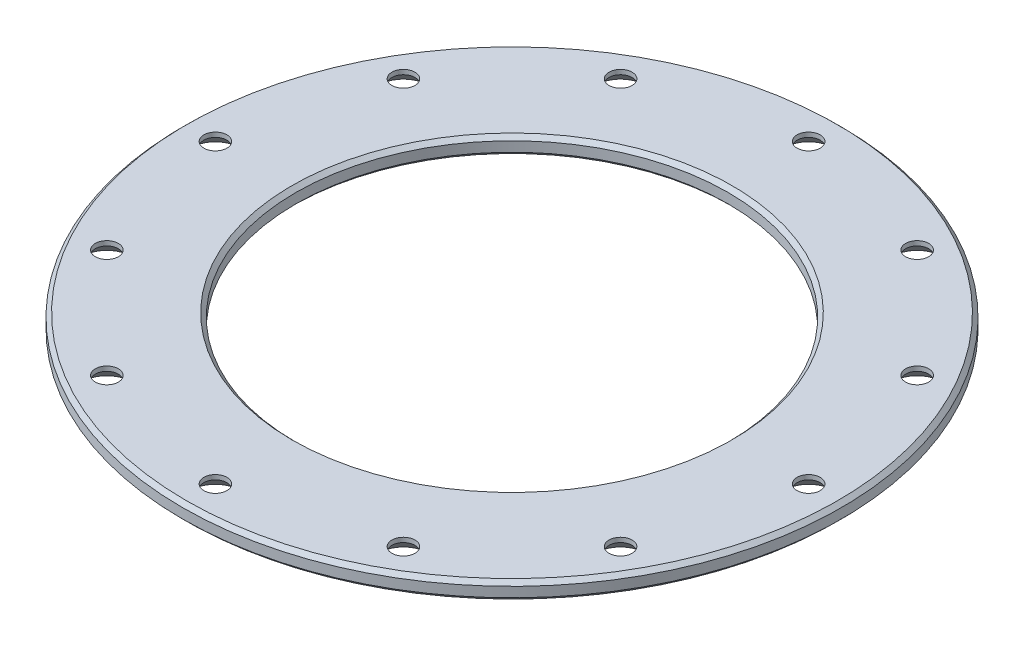
ISO-10303-21;
HEADER;
FILE_DESCRIPTION(('STEP AP214'),'2;1');
FILE_NAME('part.step','',(''),(''),'','','');
FILE_SCHEMA(('AUTOMOTIVE_DESIGN { 1 0 10303 214 1 1 1 1 }'));
ENDSEC;
DATA;
#1=APPLICATION_CONTEXT('core data for automotive mechanical design processes');
#2=APPLICATION_PROTOCOL_DEFINITION('international standard','automotive_design',2000,#1);
#3=PRODUCT_CONTEXT('',#1,'mechanical');
#4=PRODUCT('Part','Part','',(#3));
#5=PRODUCT_RELATED_PRODUCT_CATEGORY('part','',(#4));
#6=PRODUCT_DEFINITION_FORMATION('','',#4);
#7=PRODUCT_DEFINITION_CONTEXT('part definition',#1,'design');
#8=PRODUCT_DEFINITION('design','',#6,#7);
#9=PRODUCT_DEFINITION_SHAPE('','',#8);
#10=(LENGTH_UNIT() NAMED_UNIT(*) SI_UNIT(.MILLI.,.METRE.));
#11=(NAMED_UNIT(*) PLANE_ANGLE_UNIT() SI_UNIT($,.RADIAN.));
#12=(NAMED_UNIT(*) SI_UNIT($,.STERADIAN.) SOLID_ANGLE_UNIT());
#13=UNCERTAINTY_MEASURE_WITH_UNIT(LENGTH_MEASURE(1.E-05),#10,'distance_accuracy_value','');
#14=(GEOMETRIC_REPRESENTATION_CONTEXT(3) GLOBAL_UNCERTAINTY_ASSIGNED_CONTEXT((#13)) GLOBAL_UNIT_ASSIGNED_CONTEXT((#10,
#11,#12)) REPRESENTATION_CONTEXT('',''));
#15=CARTESIAN_POINT('',(0.,0.,0.));
#16=DIRECTION('',(0.,0.,1.));
#17=DIRECTION('',(1.,0.,0.));
#18=AXIS2_PLACEMENT_3D('',#15,#16,#17);
#19=CARTESIAN_POINT('',(0.,0.,0.));
#20=DIRECTION('',(0.,1.,0.));
#21=DIRECTION('',(0.,0.,1.));
#22=AXIS2_PLACEMENT_3D('',#19,#20,#21);
#23=CYLINDRICAL_SURFACE('',#22,50.);
#24=CARTESIAN_POINT('',(0.,-42.4,0.));
#25=DIRECTION('',(0.,-1.,0.));
#26=DIRECTION('',(0.,0.,-1.));
#27=AXIS2_PLACEMENT_3D('',#24,#25,#26);
#28=CIRCLE('',#27,50.);
#29=CARTESIAN_POINT('',(0.,-42.4,-50.));
#30=VERTEX_POINT('',#29);
#31=EDGE_CURVE('E52',#30,#30,#28,.F.);
#32=ORIENTED_EDGE('',*,*,#31,.T.);
#33=EDGE_LOOP('',(#32));
#34=FACE_BOUND('',#33,.T.);
#35=CARTESIAN_POINT('',(0.,-40.9,0.));
#36=DIRECTION('',(0.,1.,0.));
#37=DIRECTION('',(0.,0.,1.));
#38=AXIS2_PLACEMENT_3D('',#35,#36,#37);
#39=CIRCLE('',#38,50.);
#40=CARTESIAN_POINT('',(0.,-40.9,50.));
#41=VERTEX_POINT('',#40);
#42=EDGE_CURVE('E56',#41,#41,#39,.F.);
#43=ORIENTED_EDGE('',*,*,#42,.T.);
#44=EDGE_LOOP('',(#43));
#45=FACE_BOUND('',#44,.T.);
#46=ADVANCED_FACE('F41',(#34,#45),#23,.T.);
#47=CARTESIAN_POINT('',(0.,-43.,50.));
#48=DIRECTION('',(0.,-1.,0.));
#49=DIRECTION('',(0.,0.,-1.));
#50=AXIS2_PLACEMENT_3D('',#47,#48,#49);
#51=PLANE('',#50);
#52=CARTESIAN_POINT('',(0.,-43.,0.));
#53=DIRECTION('',(0.,-1.,0.));
#54=DIRECTION('',(0.,0.,-1.));
#55=AXIS2_PLACEMENT_3D('',#52,#53,#54);
#56=CIRCLE('',#55,33.4);
#57=CARTESIAN_POINT('',(0.,-43.,-33.4));
#58=VERTEX_POINT('',#57);
#59=EDGE_CURVE('E67',#58,#58,#56,.F.);
#60=ORIENTED_EDGE('',*,*,#59,.T.);
#61=EDGE_LOOP('',(#60));
#62=FACE_BOUND('',#61,.T.);
#63=CARTESIAN_POINT('',(0.,-43.,0.));
#64=DIRECTION('',(0.,-1.,0.));
#65=DIRECTION('',(0.,0.,-1.));
#66=AXIS2_PLACEMENT_3D('',#63,#64,#65);
#67=CIRCLE('',#66,49.4);
#68=CARTESIAN_POINT('',(0.,-43.,-49.4));
#69=VERTEX_POINT('',#68);
#70=EDGE_CURVE('E70',#69,#69,#67,.T.);
#71=ORIENTED_EDGE('',*,*,#70,.T.);
#72=EDGE_LOOP('',(#71));
#73=FACE_BOUND('',#72,.T.);
#74=CARTESIAN_POINT('',(-22.5,-43.,38.9711431702997));
#75=DIRECTION('',(0.,-1.,0.));
#76=DIRECTION('',(0.,0.,-1.));
#77=AXIS2_PLACEMENT_3D('',#74,#75,#76);
#78=CIRCLE('',#77,3.75000000000003);
#79=CARTESIAN_POINT('',(-22.5,-43.,35.2211431702997));
#80=VERTEX_POINT('',#79);
#81=EDGE_CURVE('E117',#80,#80,#78,.F.);
#82=ORIENTED_EDGE('',*,*,#81,.T.);
#83=EDGE_LOOP('',(#82));
#84=FACE_BOUND('',#83,.T.);
#85=CARTESIAN_POINT('',(0.,-43.,45.));
#86=DIRECTION('',(0.,-1.,0.));
#87=DIRECTION('',(0.,0.,-1.));
#88=AXIS2_PLACEMENT_3D('',#85,#86,#87);
#89=CIRCLE('',#88,3.75000000000003);
#90=CARTESIAN_POINT('',(0.,-43.,41.25));
#91=VERTEX_POINT('',#90);
#92=EDGE_CURVE('E121',#91,#91,#89,.F.);
#93=ORIENTED_EDGE('',*,*,#92,.T.);
#94=EDGE_LOOP('',(#93));
#95=FACE_BOUND('',#94,.T.);
#96=CARTESIAN_POINT('',(22.5,-43.,38.9711431702997));
#97=DIRECTION('',(0.,-1.,0.));
#98=DIRECTION('',(0.,0.,-1.));
#99=AXIS2_PLACEMENT_3D('',#96,#97,#98);
#100=CIRCLE('',#99,3.75000000000004);
#101=CARTESIAN_POINT('',(22.5,-43.,35.2211431702997));
#102=VERTEX_POINT('',#101);
#103=EDGE_CURVE('E125',#102,#102,#100,.F.);
#104=ORIENTED_EDGE('',*,*,#103,.T.);
#105=EDGE_LOOP('',(#104));
#106=FACE_BOUND('',#105,.T.);
#107=CARTESIAN_POINT('',(38.9711431702997,-43.,22.5));
#108=DIRECTION('',(0.,-1.,0.));
#109=DIRECTION('',(0.,0.,-1.));
#110=AXIS2_PLACEMENT_3D('',#107,#108,#109);
#111=CIRCLE('',#110,3.75000000000003);
#112=CARTESIAN_POINT('',(38.9711431702997,-43.,18.75));
#113=VERTEX_POINT('',#112);
#114=EDGE_CURVE('E129',#113,#113,#111,.F.);
#115=ORIENTED_EDGE('',*,*,#114,.T.);
#116=EDGE_LOOP('',(#115));
#117=FACE_BOUND('',#116,.T.);
#118=CARTESIAN_POINT('',(45.,-43.,0.));
#119=DIRECTION('',(0.,-1.,0.));
#120=DIRECTION('',(0.,0.,-1.));
#121=AXIS2_PLACEMENT_3D('',#118,#119,#120);
#122=CIRCLE('',#121,3.75000000000003);
#123=CARTESIAN_POINT('',(45.,-43.,-3.75000000000003));
#124=VERTEX_POINT('',#123);
#125=EDGE_CURVE('E133',#124,#124,#122,.F.);
#126=ORIENTED_EDGE('',*,*,#125,.T.);
#127=EDGE_LOOP('',(#126));
#128=FACE_BOUND('',#127,.T.);
#129=CARTESIAN_POINT('',(38.9711431702997,-43.,-22.5));
#130=DIRECTION('',(0.,-1.,0.));
#131=DIRECTION('',(0.,0.,-1.));
#132=AXIS2_PLACEMENT_3D('',#129,#130,#131);
#133=CIRCLE('',#132,3.75000000000003);
#134=CARTESIAN_POINT('',(38.9711431702997,-43.,-26.25));
#135=VERTEX_POINT('',#134);
#136=EDGE_CURVE('E137',#135,#135,#133,.F.);
#137=ORIENTED_EDGE('',*,*,#136,.T.);
#138=EDGE_LOOP('',(#137));
#139=FACE_BOUND('',#138,.T.);
#140=CARTESIAN_POINT('',(22.5,-43.,-38.9711431702997));
#141=DIRECTION('',(0.,-1.,0.));
#142=DIRECTION('',(0.,0.,-1.));
#143=AXIS2_PLACEMENT_3D('',#140,#141,#142);
#144=CIRCLE('',#143,3.74999999999997);
#145=CARTESIAN_POINT('',(22.5,-43.,-42.7211431702997));
#146=VERTEX_POINT('',#145);
#147=EDGE_CURVE('E141',#146,#146,#144,.F.);
#148=ORIENTED_EDGE('',*,*,#147,.T.);
#149=EDGE_LOOP('',(#148));
#150=FACE_BOUND('',#149,.T.);
#151=CARTESIAN_POINT('',(0.,-43.,-45.));
#152=DIRECTION('',(0.,-1.,0.));
#153=DIRECTION('',(0.,0.,-1.));
#154=AXIS2_PLACEMENT_3D('',#151,#152,#153);
#155=CIRCLE('',#154,3.75000000000001);
#156=CARTESIAN_POINT('',(0.,-43.,-48.75));
#157=VERTEX_POINT('',#156);
#158=EDGE_CURVE('E145',#157,#157,#155,.F.);
#159=ORIENTED_EDGE('',*,*,#158,.T.);
#160=EDGE_LOOP('',(#159));
#161=FACE_BOUND('',#160,.T.);
#162=CARTESIAN_POINT('',(-22.5,-43.,-38.9711431702997));
#163=DIRECTION('',(0.,-1.,0.));
#164=DIRECTION('',(0.,0.,-1.));
#165=AXIS2_PLACEMENT_3D('',#162,#163,#164);
#166=CIRCLE('',#165,3.74999999999998);
#167=CARTESIAN_POINT('',(-22.5,-43.,-42.7211431702997));
#168=VERTEX_POINT('',#167);
#169=EDGE_CURVE('E149',#168,#168,#166,.F.);
#170=ORIENTED_EDGE('',*,*,#169,.T.);
#171=EDGE_LOOP('',(#170));
#172=FACE_BOUND('',#171,.T.);
#173=CARTESIAN_POINT('',(-38.9711431702997,-43.,-22.5));
#174=DIRECTION('',(0.,-1.,0.));
#175=DIRECTION('',(0.,0.,-1.));
#176=AXIS2_PLACEMENT_3D('',#173,#174,#175);
#177=CIRCLE('',#176,3.75000000000003);
#178=CARTESIAN_POINT('',(-38.9711431702997,-43.,-26.25));
#179=VERTEX_POINT('',#178);
#180=EDGE_CURVE('E153',#179,#179,#177,.F.);
#181=ORIENTED_EDGE('',*,*,#180,.T.);
#182=EDGE_LOOP('',(#181));
#183=FACE_BOUND('',#182,.T.);
#184=CARTESIAN_POINT('',(-45.,-43.,0.));
#185=DIRECTION('',(0.,-1.,0.));
#186=DIRECTION('',(0.,0.,-1.));
#187=AXIS2_PLACEMENT_3D('',#184,#185,#186);
#188=CIRCLE('',#187,3.75000000000003);
#189=CARTESIAN_POINT('',(-45.,-43.,-3.75000000000003));
#190=VERTEX_POINT('',#189);
#191=EDGE_CURVE('E157',#190,#190,#188,.F.);
#192=ORIENTED_EDGE('',*,*,#191,.T.);
#193=EDGE_LOOP('',(#192));
#194=FACE_BOUND('',#193,.T.);
#195=CARTESIAN_POINT('',(-38.9711431702997,-43.,22.5));
#196=DIRECTION('',(0.,-1.,0.));
#197=DIRECTION('',(0.,0.,-1.));
#198=AXIS2_PLACEMENT_3D('',#195,#196,#197);
#199=CIRCLE('',#198,3.75000000000003);
#200=CARTESIAN_POINT('',(-38.9711431702997,-43.,18.75));
#201=VERTEX_POINT('',#200);
#202=EDGE_CURVE('E161',#201,#201,#199,.F.);
#203=ORIENTED_EDGE('',*,*,#202,.T.);
#204=EDGE_LOOP('',(#203));
#205=FACE_BOUND('',#204,.T.);
#206=ADVANCED_FACE('F260',(#62,#73,#84,#95,#106,#117,#128,#139,#150,#161,#172,#183,#194,#205),
#51,.T.);
#207=CARTESIAN_POINT('',(0.,0.,0.));
#208=DIRECTION('',(0.,1.,0.));
#209=DIRECTION('',(0.,0.,1.));
#210=AXIS2_PLACEMENT_3D('',#207,#208,#209);
#211=CYLINDRICAL_SURFACE('',#210,32.8);
#212=CARTESIAN_POINT('',(0.,-42.4,0.));
#213=DIRECTION('',(0.,-1.,0.));
#214=DIRECTION('',(0.,0.,-1.));
#215=AXIS2_PLACEMENT_3D('',#212,#213,#214);
#216=CIRCLE('',#215,32.8);
#217=CARTESIAN_POINT('',(0.,-42.4,-32.8));
#218=VERTEX_POINT('',#217);
#219=EDGE_CURVE('E61',#218,#218,#216,.T.);
#220=ORIENTED_EDGE('',*,*,#219,.T.);
#221=EDGE_LOOP('',(#220));
#222=FACE_BOUND('',#221,.T.);
#223=CARTESIAN_POINT('',(0.,-40.9,0.));
#224=DIRECTION('',(0.,1.,0.));
#225=DIRECTION('',(0.,0.,1.));
#226=AXIS2_PLACEMENT_3D('',#223,#224,#225);
#227=CIRCLE('',#226,32.8);
#228=CARTESIAN_POINT('',(0.,-40.9,32.8));
#229=VERTEX_POINT('',#228);
#230=EDGE_CURVE('E64',#229,#229,#227,.T.);
#231=ORIENTED_EDGE('',*,*,#230,.T.);
#232=EDGE_LOOP('',(#231));
#233=FACE_BOUND('',#232,.T.);
#234=ADVANCED_FACE('F224',(#222,#233),#211,.F.);
#235=CARTESIAN_POINT('',(0.,-40.3,32.8));
#236=DIRECTION('',(0.,1.,0.));
#237=DIRECTION('',(0.,0.,1.));
#238=AXIS2_PLACEMENT_3D('',#235,#236,#237);
#239=PLANE('',#238);
#240=CARTESIAN_POINT('',(0.,-40.3,0.));
#241=DIRECTION('',(0.,1.,0.));
#242=DIRECTION('',(0.,0.,1.));
#243=AXIS2_PLACEMENT_3D('',#240,#241,#242);
#244=CIRCLE('',#243,33.4);
#245=CARTESIAN_POINT('',(0.,-40.3,33.4));
#246=VERTEX_POINT('',#245);
#247=EDGE_CURVE('E10',#246,#246,#244,.F.);
#248=ORIENTED_EDGE('',*,*,#247,.T.);
#249=EDGE_LOOP('',(#248));
#250=FACE_BOUND('',#249,.T.);
#251=CARTESIAN_POINT('',(0.,-40.3,0.));
#252=DIRECTION('',(0.,1.,0.));
#253=DIRECTION('',(0.,0.,1.));
#254=AXIS2_PLACEMENT_3D('',#251,#252,#253);
#255=CIRCLE('',#254,49.4);
#256=CARTESIAN_POINT('',(0.,-40.3,49.4));
#257=VERTEX_POINT('',#256);
#258=EDGE_CURVE('E48',#257,#257,#255,.T.);
#259=ORIENTED_EDGE('',*,*,#258,.T.);
#260=EDGE_LOOP('',(#259));
#261=FACE_BOUND('',#260,.T.);
#262=CARTESIAN_POINT('',(-22.5,-40.3,-38.9711431702997));
#263=DIRECTION('',(0.,1.,0.));
#264=DIRECTION('',(0.,0.,1.));
#265=AXIS2_PLACEMENT_3D('',#262,#263,#264);
#266=CIRCLE('',#265,1.75);
#267=CARTESIAN_POINT('',(-22.5,-40.3,-37.2211431702997));
#268=VERTEX_POINT('',#267);
#269=EDGE_CURVE('E213',#268,#268,#266,.T.);
#270=ORIENTED_EDGE('',*,*,#269,.F.);
#271=EDGE_LOOP('',(#270));
#272=FACE_BOUND('',#271,.T.);
#273=CARTESIAN_POINT('',(-38.9711431702997,-40.3,-22.5));
#274=DIRECTION('',(0.,1.,0.));
#275=DIRECTION('',(0.,0.,1.));
#276=AXIS2_PLACEMENT_3D('',#273,#274,#275);
#277=CIRCLE('',#276,1.75);
#278=CARTESIAN_POINT('',(-38.9711431702997,-40.3,-20.75));
#279=VERTEX_POINT('',#278);
#280=EDGE_CURVE('E209',#279,#279,#277,.T.);
#281=ORIENTED_EDGE('',*,*,#280,.F.);
#282=EDGE_LOOP('',(#281));
#283=FACE_BOUND('',#282,.T.);
#284=CARTESIAN_POINT('',(-45.,-40.3,0.));
#285=DIRECTION('',(0.,1.,0.));
#286=DIRECTION('',(0.,0.,1.));
#287=AXIS2_PLACEMENT_3D('',#284,#285,#286);
#288=CIRCLE('',#287,1.75);
#289=CARTESIAN_POINT('',(-45.,-40.3,1.75));
#290=VERTEX_POINT('',#289);
#291=EDGE_CURVE('E205',#290,#290,#288,.T.);
#292=ORIENTED_EDGE('',*,*,#291,.F.);
#293=EDGE_LOOP('',(#292));
#294=FACE_BOUND('',#293,.T.);
#295=CARTESIAN_POINT('',(-38.9711431702997,-40.3,22.5));
#296=DIRECTION('',(0.,1.,0.));
#297=DIRECTION('',(0.,0.,1.));
#298=AXIS2_PLACEMENT_3D('',#295,#296,#297);
#299=CIRCLE('',#298,1.75);
#300=CARTESIAN_POINT('',(-38.9711431702997,-40.3,24.25));
#301=VERTEX_POINT('',#300);
#302=EDGE_CURVE('E201',#301,#301,#299,.T.);
#303=ORIENTED_EDGE('',*,*,#302,.F.);
#304=EDGE_LOOP('',(#303));
#305=FACE_BOUND('',#304,.T.);
#306=CARTESIAN_POINT('',(-22.5,-40.3,38.9711431702997));
#307=DIRECTION('',(0.,1.,0.));
#308=DIRECTION('',(0.,0.,1.));
#309=AXIS2_PLACEMENT_3D('',#306,#307,#308);
#310=CIRCLE('',#309,1.75);
#311=CARTESIAN_POINT('',(-22.5,-40.3,40.7211431702997));
#312=VERTEX_POINT('',#311);
#313=EDGE_CURVE('E197',#312,#312,#310,.T.);
#314=ORIENTED_EDGE('',*,*,#313,.F.);
#315=EDGE_LOOP('',(#314));
#316=FACE_BOUND('',#315,.T.);
#317=CARTESIAN_POINT('',(0.,-40.3,45.));
#318=DIRECTION('',(0.,1.,0.));
#319=DIRECTION('',(0.,0.,1.));
#320=AXIS2_PLACEMENT_3D('',#317,#318,#319);
#321=CIRCLE('',#320,1.75);
#322=CARTESIAN_POINT('',(0.,-40.3,46.75));
#323=VERTEX_POINT('',#322);
#324=EDGE_CURVE('E193',#323,#323,#321,.T.);
#325=ORIENTED_EDGE('',*,*,#324,.F.);
#326=EDGE_LOOP('',(#325));
#327=FACE_BOUND('',#326,.T.);
#328=CARTESIAN_POINT('',(22.5,-40.3,38.9711431702997));
#329=DIRECTION('',(0.,1.,0.));
#330=DIRECTION('',(0.,0.,1.));
#331=AXIS2_PLACEMENT_3D('',#328,#329,#330);
#332=CIRCLE('',#331,1.75);
#333=CARTESIAN_POINT('',(22.5,-40.3,40.7211431702997));
#334=VERTEX_POINT('',#333);
#335=EDGE_CURVE('E189',#334,#334,#332,.T.);
#336=ORIENTED_EDGE('',*,*,#335,.F.);
#337=EDGE_LOOP('',(#336));
#338=FACE_BOUND('',#337,.T.);
#339=CARTESIAN_POINT('',(38.9711431702997,-40.3,22.5));
#340=DIRECTION('',(0.,1.,0.));
#341=DIRECTION('',(0.,0.,1.));
#342=AXIS2_PLACEMENT_3D('',#339,#340,#341);
#343=CIRCLE('',#342,1.75);
#344=CARTESIAN_POINT('',(38.9711431702997,-40.3,24.25));
#345=VERTEX_POINT('',#344);
#346=EDGE_CURVE('E185',#345,#345,#343,.T.);
#347=ORIENTED_EDGE('',*,*,#346,.F.);
#348=EDGE_LOOP('',(#347));
#349=FACE_BOUND('',#348,.T.);
#350=CARTESIAN_POINT('',(45.,-40.3,0.));
#351=DIRECTION('',(0.,1.,0.));
#352=DIRECTION('',(0.,0.,1.));
#353=AXIS2_PLACEMENT_3D('',#350,#351,#352);
#354=CIRCLE('',#353,1.75);
#355=CARTESIAN_POINT('',(45.,-40.3,1.75));
#356=VERTEX_POINT('',#355);
#357=EDGE_CURVE('E181',#356,#356,#354,.T.);
#358=ORIENTED_EDGE('',*,*,#357,.F.);
#359=EDGE_LOOP('',(#358));
#360=FACE_BOUND('',#359,.T.);
#361=CARTESIAN_POINT('',(38.9711431702997,-40.3,-22.5));
#362=DIRECTION('',(0.,1.,0.));
#363=DIRECTION('',(0.,0.,1.));
#364=AXIS2_PLACEMENT_3D('',#361,#362,#363);
#365=CIRCLE('',#364,1.75);
#366=CARTESIAN_POINT('',(38.9711431702997,-40.3,-20.75));
#367=VERTEX_POINT('',#366);
#368=EDGE_CURVE('E177',#367,#367,#365,.T.);
#369=ORIENTED_EDGE('',*,*,#368,.F.);
#370=EDGE_LOOP('',(#369));
#371=FACE_BOUND('',#370,.T.);
#372=CARTESIAN_POINT('',(22.5,-40.3,-38.9711431702997));
#373=DIRECTION('',(0.,1.,0.));
#374=DIRECTION('',(0.,0.,1.));
#375=AXIS2_PLACEMENT_3D('',#372,#373,#374);
#376=CIRCLE('',#375,1.75);
#377=CARTESIAN_POINT('',(22.5,-40.3,-37.2211431702997));
#378=VERTEX_POINT('',#377);
#379=EDGE_CURVE('E173',#378,#378,#376,.T.);
#380=ORIENTED_EDGE('',*,*,#379,.F.);
#381=EDGE_LOOP('',(#380));
#382=FACE_BOUND('',#381,.T.);
#383=CARTESIAN_POINT('',(0.,-40.3,-45.));
#384=DIRECTION('',(0.,1.,0.));
#385=DIRECTION('',(0.,0.,1.));
#386=AXIS2_PLACEMENT_3D('',#383,#384,#385);
#387=CIRCLE('',#386,1.75);
#388=CARTESIAN_POINT('',(0.,-40.3,-43.25));
#389=VERTEX_POINT('',#388);
#390=EDGE_CURVE('E169',#389,#389,#387,.T.);
#391=ORIENTED_EDGE('',*,*,#390,.F.);
#392=EDGE_LOOP('',(#391));
#393=FACE_BOUND('',#392,.T.);
#394=ADVANCED_FACE('F220',(#250,#261,#272,#283,#294,#305,#316,#327,#338,#349,#360,#371,#382,
#393),#239,.T.);
#395=CARTESIAN_POINT('',(0.,-48.,-45.));
#396=DIRECTION('',(0.,1.,0.));
#397=DIRECTION('',(0.,0.,1.));
#398=AXIS2_PLACEMENT_3D('',#395,#396,#397);
#399=CYLINDRICAL_SURFACE('',#398,1.75);
#400=CARTESIAN_POINT('',(0.,-41.,-45.));
#401=DIRECTION('',(0.,-1.,0.));
#402=DIRECTION('',(0.,0.,-1.));
#403=AXIS2_PLACEMENT_3D('',#400,#401,#402);
#404=CIRCLE('',#403,1.75);
#405=CARTESIAN_POINT('',(0.,-41.,-46.75));
#406=VERTEX_POINT('',#405);
#407=EDGE_CURVE('E89',#406,#406,#404,.T.);
#408=ORIENTED_EDGE('',*,*,#407,.T.);
#409=EDGE_LOOP('',(#408));
#410=FACE_BOUND('',#409,.T.);
#411=ORIENTED_EDGE('',*,*,#390,.T.);
#412=EDGE_LOOP('',(#411));
#413=FACE_BOUND('',#412,.T.);
#414=ADVANCED_FACE('F223',(#410,#413),#399,.F.);
#415=CARTESIAN_POINT('',(22.5,-48.,-38.9711431702997));
#416=DIRECTION('',(0.,1.,0.));
#417=DIRECTION('',(0.,0.,1.));
#418=AXIS2_PLACEMENT_3D('',#415,#416,#417);
#419=CYLINDRICAL_SURFACE('',#418,1.75);
#420=CARTESIAN_POINT('',(22.5,-41.,-38.9711431702997));
#421=DIRECTION('',(0.,-1.,0.));
#422=DIRECTION('',(0.,0.,-1.));
#423=AXIS2_PLACEMENT_3D('',#420,#421,#422);
#424=CIRCLE('',#423,1.75);
#425=CARTESIAN_POINT('',(22.5,-41.,-40.7211431702997));
#426=VERTEX_POINT('',#425);
#427=EDGE_CURVE('E93',#426,#426,#424,.T.);
#428=ORIENTED_EDGE('',*,*,#427,.T.);
#429=EDGE_LOOP('',(#428));
#430=FACE_BOUND('',#429,.T.);
#431=ORIENTED_EDGE('',*,*,#379,.T.);
#432=EDGE_LOOP('',(#431));
#433=FACE_BOUND('',#432,.T.);
#434=ADVANCED_FACE('F249',(#430,#433),#419,.F.);
#435=CARTESIAN_POINT('',(38.9711431702997,-48.,-22.5));
#436=DIRECTION('',(0.,1.,0.));
#437=DIRECTION('',(0.,0.,1.));
#438=AXIS2_PLACEMENT_3D('',#435,#436,#437);
#439=CYLINDRICAL_SURFACE('',#438,1.75);
#440=CARTESIAN_POINT('',(38.9711431702997,-41.,-22.5));
#441=DIRECTION('',(0.,-1.,0.));
#442=DIRECTION('',(0.,0.,-1.));
#443=AXIS2_PLACEMENT_3D('',#440,#441,#442);
#444=CIRCLE('',#443,1.75);
#445=CARTESIAN_POINT('',(38.9711431702997,-41.,-24.25));
#446=VERTEX_POINT('',#445);
#447=EDGE_CURVE('E97',#446,#446,#444,.T.);
#448=ORIENTED_EDGE('',*,*,#447,.T.);
#449=EDGE_LOOP('',(#448));
#450=FACE_BOUND('',#449,.T.);
#451=ORIENTED_EDGE('',*,*,#368,.T.);
#452=EDGE_LOOP('',(#451));
#453=FACE_BOUND('',#452,.T.);
#454=ADVANCED_FACE('F256',(#450,#453),#439,.F.);
#455=CARTESIAN_POINT('',(45.,-48.,0.));
#456=DIRECTION('',(0.,1.,0.));
#457=DIRECTION('',(0.,0.,1.));
#458=AXIS2_PLACEMENT_3D('',#455,#456,#457);
#459=CYLINDRICAL_SURFACE('',#458,1.75);
#460=CARTESIAN_POINT('',(45.,-41.,0.));
#461=DIRECTION('',(0.,-1.,0.));
#462=DIRECTION('',(0.,0.,-1.));
#463=AXIS2_PLACEMENT_3D('',#460,#461,#462);
#464=CIRCLE('',#463,1.75);
#465=CARTESIAN_POINT('',(45.,-41.,-1.75));
#466=VERTEX_POINT('',#465);
#467=EDGE_CURVE('E101',#466,#466,#464,.T.);
#468=ORIENTED_EDGE('',*,*,#467,.T.);
#469=EDGE_LOOP('',(#468));
#470=FACE_BOUND('',#469,.T.);
#471=ORIENTED_EDGE('',*,*,#357,.T.);
#472=EDGE_LOOP('',(#471));
#473=FACE_BOUND('',#472,.T.);
#474=ADVANCED_FACE('F401',(#470,#473),#459,.F.);
#475=CARTESIAN_POINT('',(38.9711431702997,-48.,22.5));
#476=DIRECTION('',(0.,1.,0.));
#477=DIRECTION('',(0.,0.,1.));
#478=AXIS2_PLACEMENT_3D('',#475,#476,#477);
#479=CYLINDRICAL_SURFACE('',#478,1.75);
#480=CARTESIAN_POINT('',(38.9711431702997,-41.,22.5));
#481=DIRECTION('',(0.,-1.,0.));
#482=DIRECTION('',(0.,0.,-1.));
#483=AXIS2_PLACEMENT_3D('',#480,#481,#482);
#484=CIRCLE('',#483,1.75);
#485=CARTESIAN_POINT('',(38.9711431702997,-41.,20.75));
#486=VERTEX_POINT('',#485);
#487=EDGE_CURVE('E105',#486,#486,#484,.T.);
#488=ORIENTED_EDGE('',*,*,#487,.T.);
#489=EDGE_LOOP('',(#488));
#490=FACE_BOUND('',#489,.T.);
#491=ORIENTED_EDGE('',*,*,#346,.T.);
#492=EDGE_LOOP('',(#491));
#493=FACE_BOUND('',#492,.T.);
#494=ADVANCED_FACE('F397',(#490,#493),#479,.F.);
#495=CARTESIAN_POINT('',(22.5,-48.,38.9711431702997));
#496=DIRECTION('',(0.,1.,0.));
#497=DIRECTION('',(0.,0.,1.));
#498=AXIS2_PLACEMENT_3D('',#495,#496,#497);
#499=CYLINDRICAL_SURFACE('',#498,1.75);
#500=CARTESIAN_POINT('',(22.5,-41.,38.9711431702997));
#501=DIRECTION('',(0.,-1.,0.));
#502=DIRECTION('',(0.,0.,-1.));
#503=AXIS2_PLACEMENT_3D('',#500,#501,#502);
#504=CIRCLE('',#503,1.75);
#505=CARTESIAN_POINT('',(22.5,-41.,37.2211431702997));
#506=VERTEX_POINT('',#505);
#507=EDGE_CURVE('E109',#506,#506,#504,.T.);
#508=ORIENTED_EDGE('',*,*,#507,.T.);
#509=EDGE_LOOP('',(#508));
#510=FACE_BOUND('',#509,.T.);
#511=ORIENTED_EDGE('',*,*,#335,.T.);
#512=EDGE_LOOP('',(#511));
#513=FACE_BOUND('',#512,.T.);
#514=ADVANCED_FACE('F393',(#510,#513),#499,.F.);
#515=CARTESIAN_POINT('',(0.,-48.,45.));
#516=DIRECTION('',(0.,1.,0.));
#517=DIRECTION('',(0.,0.,1.));
#518=AXIS2_PLACEMENT_3D('',#515,#516,#517);
#519=CYLINDRICAL_SURFACE('',#518,1.75);
#520=CARTESIAN_POINT('',(0.,-41.,45.));
#521=DIRECTION('',(0.,-1.,0.));
#522=DIRECTION('',(0.,0.,-1.));
#523=AXIS2_PLACEMENT_3D('',#520,#521,#522);
#524=CIRCLE('',#523,1.75);
#525=CARTESIAN_POINT('',(0.,-41.,43.25));
#526=VERTEX_POINT('',#525);
#527=EDGE_CURVE('E113',#526,#526,#524,.T.);
#528=ORIENTED_EDGE('',*,*,#527,.T.);
#529=EDGE_LOOP('',(#528));
#530=FACE_BOUND('',#529,.T.);
#531=ORIENTED_EDGE('',*,*,#324,.T.);
#532=EDGE_LOOP('',(#531));
#533=FACE_BOUND('',#532,.T.);
#534=ADVANCED_FACE('F386',(#530,#533),#519,.F.);
#535=CARTESIAN_POINT('',(-22.5,-48.,38.9711431702997));
#536=DIRECTION('',(0.,1.,0.));
#537=DIRECTION('',(0.,0.,1.));
#538=AXIS2_PLACEMENT_3D('',#535,#536,#537);
#539=CYLINDRICAL_SURFACE('',#538,1.75);
#540=CARTESIAN_POINT('',(-22.5,-41.,38.9711431702997));
#541=DIRECTION('',(0.,-1.,0.));
#542=DIRECTION('',(0.,0.,-1.));
#543=AXIS2_PLACEMENT_3D('',#540,#541,#542);
#544=CIRCLE('',#543,1.75);
#545=CARTESIAN_POINT('',(-22.5,-41.,37.2211431702997));
#546=VERTEX_POINT('',#545);
#547=EDGE_CURVE('E165',#546,#546,#544,.T.);
#548=ORIENTED_EDGE('',*,*,#547,.T.);
#549=EDGE_LOOP('',(#548));
#550=FACE_BOUND('',#549,.T.);
#551=ORIENTED_EDGE('',*,*,#313,.T.);
#552=EDGE_LOOP('',(#551));
#553=FACE_BOUND('',#552,.T.);
#554=ADVANCED_FACE('F377',(#550,#553),#539,.F.);
#555=CARTESIAN_POINT('',(-38.9711431702997,-48.,22.5));
#556=DIRECTION('',(0.,1.,0.));
#557=DIRECTION('',(0.,0.,1.));
#558=AXIS2_PLACEMENT_3D('',#555,#556,#557);
#559=CYLINDRICAL_SURFACE('',#558,1.75);
#560=CARTESIAN_POINT('',(-38.9711431702997,-41.,22.5));
#561=DIRECTION('',(0.,-1.,0.));
#562=DIRECTION('',(0.,0.,-1.));
#563=AXIS2_PLACEMENT_3D('',#560,#561,#562);
#564=CIRCLE('',#563,1.75);
#565=CARTESIAN_POINT('',(-38.9711431702997,-41.,20.75));
#566=VERTEX_POINT('',#565);
#567=EDGE_CURVE('E73',#566,#566,#564,.T.);
#568=ORIENTED_EDGE('',*,*,#567,.T.);
#569=EDGE_LOOP('',(#568));
#570=FACE_BOUND('',#569,.T.);
#571=ORIENTED_EDGE('',*,*,#302,.T.);
#572=EDGE_LOOP('',(#571));
#573=FACE_BOUND('',#572,.T.);
#574=ADVANCED_FACE('F373',(#570,#573),#559,.F.);
#575=CARTESIAN_POINT('',(-45.,-48.,0.));
#576=DIRECTION('',(0.,1.,0.));
#577=DIRECTION('',(0.,0.,1.));
#578=AXIS2_PLACEMENT_3D('',#575,#576,#577);
#579=CYLINDRICAL_SURFACE('',#578,1.75);
#580=CARTESIAN_POINT('',(-45.,-41.,0.));
#581=DIRECTION('',(0.,-1.,0.));
#582=DIRECTION('',(0.,0.,-1.));
#583=AXIS2_PLACEMENT_3D('',#580,#581,#582);
#584=CIRCLE('',#583,1.75);
#585=CARTESIAN_POINT('',(-45.,-41.,-1.75000000000001));
#586=VERTEX_POINT('',#585);
#587=EDGE_CURVE('E77',#586,#586,#584,.T.);
#588=ORIENTED_EDGE('',*,*,#587,.T.);
#589=EDGE_LOOP('',(#588));
#590=FACE_BOUND('',#589,.T.);
#591=ORIENTED_EDGE('',*,*,#291,.T.);
#592=EDGE_LOOP('',(#591));
#593=FACE_BOUND('',#592,.T.);
#594=ADVANCED_FACE('F376',(#590,#593),#579,.F.);
#595=CARTESIAN_POINT('',(-38.9711431702997,-48.,-22.5));
#596=DIRECTION('',(0.,1.,0.));
#597=DIRECTION('',(0.,0.,1.));
#598=AXIS2_PLACEMENT_3D('',#595,#596,#597);
#599=CYLINDRICAL_SURFACE('',#598,1.75);
#600=CARTESIAN_POINT('',(-38.9711431702997,-41.,-22.5));
#601=DIRECTION('',(0.,-1.,0.));
#602=DIRECTION('',(0.,0.,-1.));
#603=AXIS2_PLACEMENT_3D('',#600,#601,#602);
#604=CIRCLE('',#603,1.75);
#605=CARTESIAN_POINT('',(-38.9711431702997,-41.,-24.25));
#606=VERTEX_POINT('',#605);
#607=EDGE_CURVE('E81',#606,#606,#604,.T.);
#608=ORIENTED_EDGE('',*,*,#607,.T.);
#609=EDGE_LOOP('',(#608));
#610=FACE_BOUND('',#609,.T.);
#611=ORIENTED_EDGE('',*,*,#280,.T.);
#612=EDGE_LOOP('',(#611));
#613=FACE_BOUND('',#612,.T.);
#614=ADVANCED_FACE('F383',(#610,#613),#599,.F.);
#615=CARTESIAN_POINT('',(-22.5,-48.,-38.9711431702997));
#616=DIRECTION('',(0.,1.,0.));
#617=DIRECTION('',(0.,0.,1.));
#618=AXIS2_PLACEMENT_3D('',#615,#616,#617);
#619=CYLINDRICAL_SURFACE('',#618,1.75);
#620=CARTESIAN_POINT('',(-22.5,-41.,-38.9711431702997));
#621=DIRECTION('',(0.,-1.,0.));
#622=DIRECTION('',(0.,0.,-1.));
#623=AXIS2_PLACEMENT_3D('',#620,#621,#622);
#624=CIRCLE('',#623,1.75);
#625=CARTESIAN_POINT('',(-22.5,-41.,-40.7211431702997));
#626=VERTEX_POINT('',#625);
#627=EDGE_CURVE('E85',#626,#626,#624,.T.);
#628=ORIENTED_EDGE('',*,*,#627,.T.);
#629=EDGE_LOOP('',(#628));
#630=FACE_BOUND('',#629,.T.);
#631=ORIENTED_EDGE('',*,*,#269,.T.);
#632=EDGE_LOOP('',(#631));
#633=FACE_BOUND('',#632,.T.);
#634=ADVANCED_FACE('F218',(#630,#633),#619,.F.);
#635=CARTESIAN_POINT('',(-22.5,-41.,38.9711431702997));
#636=DIRECTION('',(0.,-1.,0.));
#637=DIRECTION('',(0.,0.,-1.));
#638=AXIS2_PLACEMENT_3D('',#635,#636,#637);
#639=CONICAL_SURFACE('',#638,1.75,0.78539816339745);
#640=ORIENTED_EDGE('',*,*,#81,.F.);
#641=EDGE_LOOP('',(#640));
#642=FACE_BOUND('',#641,.T.);
#643=ORIENTED_EDGE('',*,*,#547,.F.);
#644=EDGE_LOOP('',(#643));
#645=FACE_BOUND('',#644,.T.);
#646=ADVANCED_FACE('F272',(#642,#645),#639,.F.);
#647=CARTESIAN_POINT('',(0.,-41.,45.));
#648=DIRECTION('',(0.,-1.,0.));
#649=DIRECTION('',(0.,0.,-1.));
#650=AXIS2_PLACEMENT_3D('',#647,#648,#649);
#651=CONICAL_SURFACE('',#650,1.75,0.78539816339745);
#652=ORIENTED_EDGE('',*,*,#92,.F.);
#653=EDGE_LOOP('',(#652));
#654=FACE_BOUND('',#653,.T.);
#655=ORIENTED_EDGE('',*,*,#527,.F.);
#656=EDGE_LOOP('',(#655));
#657=FACE_BOUND('',#656,.T.);
#658=ADVANCED_FACE('F275',(#654,#657),#651,.F.);
#659=CARTESIAN_POINT('',(22.5,-41.,38.9711431702997));
#660=DIRECTION('',(0.,-1.,0.));
#661=DIRECTION('',(0.,0.,-1.));
#662=AXIS2_PLACEMENT_3D('',#659,#660,#661);
#663=CONICAL_SURFACE('',#662,1.75,0.785398163397453);
#664=ORIENTED_EDGE('',*,*,#103,.F.);
#665=EDGE_LOOP('',(#664));
#666=FACE_BOUND('',#665,.T.);
#667=ORIENTED_EDGE('',*,*,#507,.F.);
#668=EDGE_LOOP('',(#667));
#669=FACE_BOUND('',#668,.T.);
#670=ADVANCED_FACE('F279',(#666,#669),#663,.F.);
#671=CARTESIAN_POINT('',(38.9711431702997,-41.,22.5));
#672=DIRECTION('',(0.,-1.,0.));
#673=DIRECTION('',(0.,0.,-1.));
#674=AXIS2_PLACEMENT_3D('',#671,#672,#673);
#675=CONICAL_SURFACE('',#674,1.75,0.785398163397451);
#676=ORIENTED_EDGE('',*,*,#114,.F.);
#677=EDGE_LOOP('',(#676));
#678=FACE_BOUND('',#677,.T.);
#679=ORIENTED_EDGE('',*,*,#487,.F.);
#680=EDGE_LOOP('',(#679));
#681=FACE_BOUND('',#680,.T.);
#682=ADVANCED_FACE('F283',(#678,#681),#675,.F.);
#683=CARTESIAN_POINT('',(45.,-41.,0.));
#684=DIRECTION('',(0.,-1.,0.));
#685=DIRECTION('',(0.,0.,-1.));
#686=AXIS2_PLACEMENT_3D('',#683,#684,#685);
#687=CONICAL_SURFACE('',#686,1.75,0.785398163397449);
#688=ORIENTED_EDGE('',*,*,#125,.F.);
#689=EDGE_LOOP('',(#688));
#690=FACE_BOUND('',#689,.T.);
#691=ORIENTED_EDGE('',*,*,#467,.F.);
#692=EDGE_LOOP('',(#691));
#693=FACE_BOUND('',#692,.T.);
#694=ADVANCED_FACE('F287',(#690,#693),#687,.F.);
#695=CARTESIAN_POINT('',(38.9711431702997,-41.,-22.5));
#696=DIRECTION('',(0.,-1.,0.));
#697=DIRECTION('',(0.,0.,-1.));
#698=AXIS2_PLACEMENT_3D('',#695,#696,#697);
#699=CONICAL_SURFACE('',#698,1.75,0.785398163397451);
#700=ORIENTED_EDGE('',*,*,#136,.F.);
#701=EDGE_LOOP('',(#700));
#702=FACE_BOUND('',#701,.T.);
#703=ORIENTED_EDGE('',*,*,#447,.F.);
#704=EDGE_LOOP('',(#703));
#705=FACE_BOUND('',#704,.T.);
#706=ADVANCED_FACE('F291',(#702,#705),#699,.F.);
#707=CARTESIAN_POINT('',(22.5,-41.,-38.9711431702997));
#708=DIRECTION('',(0.,-1.,0.));
#709=DIRECTION('',(0.,0.,-1.));
#710=AXIS2_PLACEMENT_3D('',#707,#708,#709);
#711=CONICAL_SURFACE('',#710,1.75,0.78539816339745);
#712=ORIENTED_EDGE('',*,*,#147,.F.);
#713=EDGE_LOOP('',(#712));
#714=FACE_BOUND('',#713,.T.);
#715=ORIENTED_EDGE('',*,*,#427,.F.);
#716=EDGE_LOOP('',(#715));
#717=FACE_BOUND('',#716,.T.);
#718=ADVANCED_FACE('F295',(#714,#717),#711,.F.);
#719=CARTESIAN_POINT('',(0.,-41.,-45.));
#720=DIRECTION('',(0.,-1.,0.));
#721=DIRECTION('',(0.,0.,-1.));
#722=AXIS2_PLACEMENT_3D('',#719,#720,#721);
#723=CONICAL_SURFACE('',#722,1.75,0.785398163397449);
#724=ORIENTED_EDGE('',*,*,#158,.F.);
#725=EDGE_LOOP('',(#724));
#726=FACE_BOUND('',#725,.T.);
#727=ORIENTED_EDGE('',*,*,#407,.F.);
#728=EDGE_LOOP('',(#727));
#729=FACE_BOUND('',#728,.T.);
#730=ADVANCED_FACE('F299',(#726,#729),#723,.F.);
#731=CARTESIAN_POINT('',(-22.5,-41.,-38.9711431702997));
#732=DIRECTION('',(0.,-1.,0.));
#733=DIRECTION('',(0.,0.,-1.));
#734=AXIS2_PLACEMENT_3D('',#731,#732,#733);
#735=CONICAL_SURFACE('',#734,1.75,0.785398163397451);
#736=ORIENTED_EDGE('',*,*,#169,.F.);
#737=EDGE_LOOP('',(#736));
#738=FACE_BOUND('',#737,.T.);
#739=ORIENTED_EDGE('',*,*,#627,.F.);
#740=EDGE_LOOP('',(#739));
#741=FACE_BOUND('',#740,.T.);
#742=ADVANCED_FACE('F303',(#738,#741),#735,.F.);
#743=CARTESIAN_POINT('',(-38.9711431702997,-41.,-22.5));
#744=DIRECTION('',(0.,-1.,0.));
#745=DIRECTION('',(0.,0.,-1.));
#746=AXIS2_PLACEMENT_3D('',#743,#744,#745);
#747=CONICAL_SURFACE('',#746,1.75,0.785398163397451);
#748=ORIENTED_EDGE('',*,*,#180,.F.);
#749=EDGE_LOOP('',(#748));
#750=FACE_BOUND('',#749,.T.);
#751=ORIENTED_EDGE('',*,*,#607,.F.);
#752=EDGE_LOOP('',(#751));
#753=FACE_BOUND('',#752,.T.);
#754=ADVANCED_FACE('F307',(#750,#753),#747,.F.);
#755=CARTESIAN_POINT('',(-45.,-41.,0.));
#756=DIRECTION('',(0.,-1.,0.));
#757=DIRECTION('',(0.,0.,-1.));
#758=AXIS2_PLACEMENT_3D('',#755,#756,#757);
#759=CONICAL_SURFACE('',#758,1.75,0.785398163397449);
#760=ORIENTED_EDGE('',*,*,#191,.F.);
#761=EDGE_LOOP('',(#760));
#762=FACE_BOUND('',#761,.T.);
#763=ORIENTED_EDGE('',*,*,#587,.F.);
#764=EDGE_LOOP('',(#763));
#765=FACE_BOUND('',#764,.T.);
#766=ADVANCED_FACE('F311',(#762,#765),#759,.F.);
#767=CARTESIAN_POINT('',(-38.9711431702997,-41.,22.5));
#768=DIRECTION('',(0.,-1.,0.));
#769=DIRECTION('',(0.,0.,-1.));
#770=AXIS2_PLACEMENT_3D('',#767,#768,#769);
#771=CONICAL_SURFACE('',#770,1.75,0.785398163397451);
#772=ORIENTED_EDGE('',*,*,#202,.F.);
#773=EDGE_LOOP('',(#772));
#774=FACE_BOUND('',#773,.T.);
#775=ORIENTED_EDGE('',*,*,#567,.F.);
#776=EDGE_LOOP('',(#775));
#777=FACE_BOUND('',#776,.T.);
#778=ADVANCED_FACE('F315',(#774,#777),#771,.F.);
#779=CARTESIAN_POINT('',(0.,-43.,0.));
#780=DIRECTION('',(0.,-1.,0.));
#781=DIRECTION('',(0.,0.,-1.));
#782=AXIS2_PLACEMENT_3D('',#779,#780,#781);
#783=CONICAL_SURFACE('',#782,33.4,0.785398163397448);
#784=ORIENTED_EDGE('',*,*,#219,.F.);
#785=EDGE_LOOP('',(#784));
#786=FACE_BOUND('',#785,.T.);
#787=ORIENTED_EDGE('',*,*,#59,.F.);
#788=EDGE_LOOP('',(#787));
#789=FACE_BOUND('',#788,.T.);
#790=ADVANCED_FACE('F319',(#786,#789),#783,.F.);
#791=CARTESIAN_POINT('',(0.,-42.4,0.));
#792=DIRECTION('',(0.,1.,0.));
#793=DIRECTION('',(0.,0.,1.));
#794=AXIS2_PLACEMENT_3D('',#791,#792,#793);
#795=CONICAL_SURFACE('',#794,50.,0.785398163397448);
#796=ORIENTED_EDGE('',*,*,#70,.F.);
#797=EDGE_LOOP('',(#796));
#798=FACE_BOUND('',#797,.T.);
#799=ORIENTED_EDGE('',*,*,#31,.F.);
#800=EDGE_LOOP('',(#799));
#801=FACE_BOUND('',#800,.T.);
#802=ADVANCED_FACE('F323',(#798,#801),#795,.T.);
#803=CARTESIAN_POINT('',(0.,-40.9,0.));
#804=DIRECTION('',(0.,1.,0.));
#805=DIRECTION('',(0.,0.,1.));
#806=AXIS2_PLACEMENT_3D('',#803,#804,#805);
#807=CONICAL_SURFACE('',#806,32.8,0.785398163397466);
#808=ORIENTED_EDGE('',*,*,#247,.F.);
#809=EDGE_LOOP('',(#808));
#810=FACE_BOUND('',#809,.T.);
#811=ORIENTED_EDGE('',*,*,#230,.F.);
#812=EDGE_LOOP('',(#811));
#813=FACE_BOUND('',#812,.T.);
#814=ADVANCED_FACE('F326',(#810,#813),#807,.F.);
#815=CARTESIAN_POINT('',(0.,-40.3,0.));
#816=DIRECTION('',(0.,-1.,0.));
#817=DIRECTION('',(0.,0.,-1.));
#818=AXIS2_PLACEMENT_3D('',#815,#816,#817);
#819=CONICAL_SURFACE('',#818,49.4,0.785398163397443);
#820=ORIENTED_EDGE('',*,*,#42,.F.);
#821=EDGE_LOOP('',(#820));
#822=FACE_BOUND('',#821,.T.);
#823=ORIENTED_EDGE('',*,*,#258,.F.);
#824=EDGE_LOOP('',(#823));
#825=FACE_BOUND('',#824,.T.);
#826=ADVANCED_FACE('F43',(#822,#825),#819,.T.);
#827=CLOSED_SHELL('',(#46,#206,#234,#394,#414,#434,#454,#474,#494,#514,#534,#554,#574,#594,#614,
#634,#646,#658,#670,#682,#694,#706,#718,#730,#742,#754,#766,#778,#790,#802,#814,#826));
#828=MANIFOLD_SOLID_BREP('B2',#827);
#829=ADVANCED_BREP_SHAPE_REPRESENTATION('',(#18,#828),#14);
#830=SHAPE_DEFINITION_REPRESENTATION(#9,#829);
ENDSEC;
END-ISO-10303-21;
